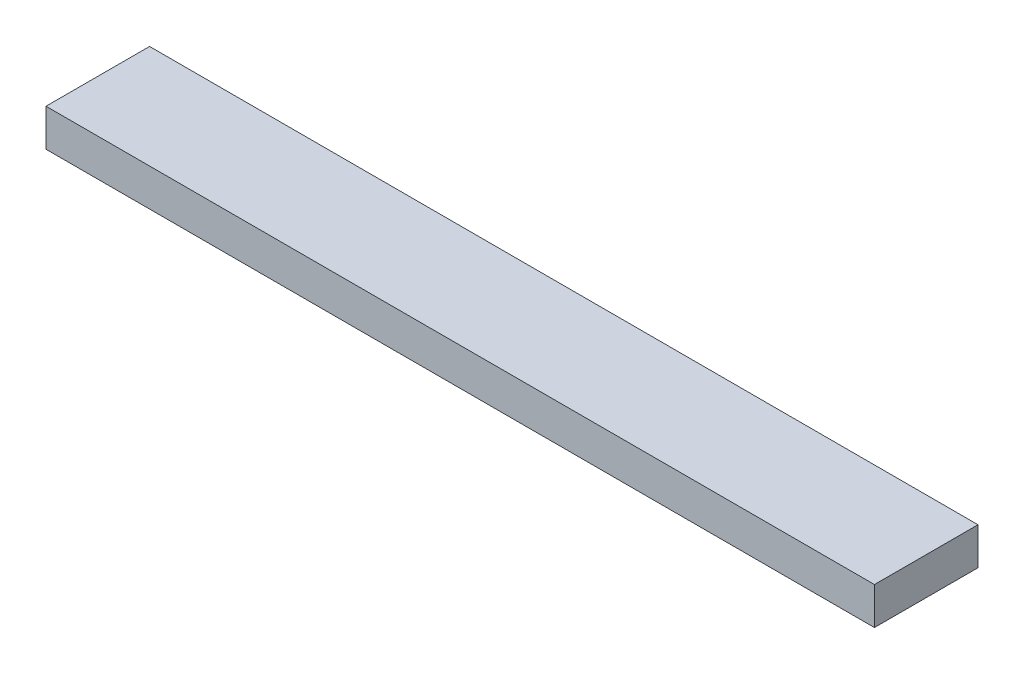
ISO-10303-21;
HEADER;
FILE_DESCRIPTION(('STEP AP214'),'2;1');
FILE_NAME('part.step','',(''),(''),'','','');
FILE_SCHEMA(('AUTOMOTIVE_DESIGN { 1 0 10303 214 1 1 1 1 }'));
ENDSEC;
DATA;
#1=APPLICATION_CONTEXT('core data for automotive mechanical design processes');
#2=APPLICATION_PROTOCOL_DEFINITION('international standard','automotive_design',2000,#1);
#3=PRODUCT_CONTEXT('',#1,'mechanical');
#4=PRODUCT('Part','Part','',(#3));
#5=PRODUCT_RELATED_PRODUCT_CATEGORY('part','',(#4));
#6=PRODUCT_DEFINITION_FORMATION('','',#4);
#7=PRODUCT_DEFINITION_CONTEXT('part definition',#1,'design');
#8=PRODUCT_DEFINITION('design','',#6,#7);
#9=PRODUCT_DEFINITION_SHAPE('','',#8);
#10=(LENGTH_UNIT() NAMED_UNIT(*) SI_UNIT(.MILLI.,.METRE.));
#11=(NAMED_UNIT(*) PLANE_ANGLE_UNIT() SI_UNIT($,.RADIAN.));
#12=(NAMED_UNIT(*) SI_UNIT($,.STERADIAN.) SOLID_ANGLE_UNIT());
#13=UNCERTAINTY_MEASURE_WITH_UNIT(LENGTH_MEASURE(1.E-05),#10,'distance_accuracy_value','');
#14=(GEOMETRIC_REPRESENTATION_CONTEXT(3) GLOBAL_UNCERTAINTY_ASSIGNED_CONTEXT((#13)) GLOBAL_UNIT_ASSIGNED_CONTEXT((#10,
#11,#12)) REPRESENTATION_CONTEXT('',''));
#15=CARTESIAN_POINT('',(0.,0.,0.));
#16=DIRECTION('',(0.,0.,1.));
#17=DIRECTION('',(1.,0.,0.));
#18=AXIS2_PLACEMENT_3D('',#15,#16,#17);
#19=CARTESIAN_POINT('',(50.,4.5,6.25000000000001));
#20=DIRECTION('',(-1.,0.,0.));
#21=DIRECTION('',(0.,0.,1.));
#22=AXIS2_PLACEMENT_3D('',#19,#20,#21);
#23=PLANE('',#22);
#24=DIRECTION('',(0.,0.,-1.));
#25=VECTOR('',#24,1.);
#26=CARTESIAN_POINT('',(50.,0.,6.25000000000001));
#27=LINE('',#26,#25);
#28=CARTESIAN_POINT('',(50.,0.,6.25000000000001));
#29=VERTEX_POINT('',#28);
#30=CARTESIAN_POINT('',(50.,0.,-6.24999999999999));
#31=VERTEX_POINT('',#30);
#32=EDGE_CURVE('E103',#29,#31,#27,.T.);
#33=ORIENTED_EDGE('',*,*,#32,.T.);
#34=DIRECTION('',(0.,-1.,0.));
#35=VECTOR('',#34,1.);
#36=CARTESIAN_POINT('',(50.,4.5,-6.24999999999999));
#37=LINE('',#36,#35);
#38=CARTESIAN_POINT('',(50.,4.5,-6.24999999999999));
#39=VERTEX_POINT('',#38);
#40=EDGE_CURVE('E11',#39,#31,#37,.T.);
#41=ORIENTED_EDGE('',*,*,#40,.F.);
#42=DIRECTION('',(0.,0.,-1.));
#43=VECTOR('',#42,1.);
#44=CARTESIAN_POINT('',(50.,4.5,6.25000000000001));
#45=LINE('',#44,#43);
#46=CARTESIAN_POINT('',(50.,4.5,6.25000000000001));
#47=VERTEX_POINT('',#46);
#48=EDGE_CURVE('E91',#47,#39,#45,.T.);
#49=ORIENTED_EDGE('',*,*,#48,.F.);
#50=DIRECTION('',(0.,-1.,0.));
#51=VECTOR('',#50,1.);
#52=CARTESIAN_POINT('',(50.,4.5,6.25000000000001));
#53=LINE('',#52,#51);
#54=EDGE_CURVE('E99',#47,#29,#53,.T.);
#55=ORIENTED_EDGE('',*,*,#54,.T.);
#56=EDGE_LOOP('',(#33,#41,#49,#55));
#57=FACE_BOUND('',#56,.T.);
#58=ADVANCED_FACE('F40',(#57),#23,.F.);
#59=CARTESIAN_POINT('',(-50.,4.5,-6.24999999999999));
#60=DIRECTION('',(0.,0.,1.));
#61=DIRECTION('',(1.,0.,0.));
#62=AXIS2_PLACEMENT_3D('',#59,#60,#61);
#63=PLANE('',#62);
#64=DIRECTION('',(-1.,0.,0.));
#65=VECTOR('',#64,1.);
#66=CARTESIAN_POINT('',(-50.,0.,-6.24999999999999));
#67=LINE('',#66,#65);
#68=CARTESIAN_POINT('',(-50.,0.,-6.24999999999999));
#69=VERTEX_POINT('',#68);
#70=EDGE_CURVE('E95',#31,#69,#67,.T.);
#71=ORIENTED_EDGE('',*,*,#70,.T.);
#72=DIRECTION('',(0.,-1.,0.));
#73=VECTOR('',#72,1.);
#74=CARTESIAN_POINT('',(-50.,4.5,-6.24999999999999));
#75=LINE('',#74,#73);
#76=CARTESIAN_POINT('',(-50.,4.5,-6.24999999999999));
#77=VERTEX_POINT('',#76);
#78=EDGE_CURVE('E48',#77,#69,#75,.T.);
#79=ORIENTED_EDGE('',*,*,#78,.F.);
#80=DIRECTION('',(-1.,0.,0.));
#81=VECTOR('',#80,1.);
#82=CARTESIAN_POINT('',(-50.,4.5,-6.24999999999999));
#83=LINE('',#82,#81);
#84=EDGE_CURVE('E86',#39,#77,#83,.T.);
#85=ORIENTED_EDGE('',*,*,#84,.F.);
#86=ORIENTED_EDGE('',*,*,#40,.T.);
#87=EDGE_LOOP('',(#71,#79,#85,#86));
#88=FACE_BOUND('',#87,.T.);
#89=ADVANCED_FACE('F94',(#88),#63,.F.);
#90=CARTESIAN_POINT('',(-50.,4.5,6.25000000000001));
#91=DIRECTION('',(1.,0.,0.));
#92=DIRECTION('',(0.,0.,-1.));
#93=AXIS2_PLACEMENT_3D('',#90,#91,#92);
#94=PLANE('',#93);
#95=DIRECTION('',(0.,0.,1.));
#96=VECTOR('',#95,1.);
#97=CARTESIAN_POINT('',(-50.,0.,6.25000000000001));
#98=LINE('',#97,#96);
#99=CARTESIAN_POINT('',(-50.,0.,6.25000000000001));
#100=VERTEX_POINT('',#99);
#101=EDGE_CURVE('E73',#69,#100,#98,.T.);
#102=ORIENTED_EDGE('',*,*,#101,.T.);
#103=DIRECTION('',(0.,-1.,0.));
#104=VECTOR('',#103,1.);
#105=CARTESIAN_POINT('',(-50.,4.5,6.25000000000001));
#106=LINE('',#105,#104);
#107=CARTESIAN_POINT('',(-50.,4.5,6.25000000000001));
#108=VERTEX_POINT('',#107);
#109=EDGE_CURVE('E96',#108,#100,#106,.T.);
#110=ORIENTED_EDGE('',*,*,#109,.F.);
#111=DIRECTION('',(0.,0.,1.));
#112=VECTOR('',#111,1.);
#113=CARTESIAN_POINT('',(-50.,4.5,6.25000000000001));
#114=LINE('',#113,#112);
#115=EDGE_CURVE('E89',#77,#108,#114,.T.);
#116=ORIENTED_EDGE('',*,*,#115,.F.);
#117=ORIENTED_EDGE('',*,*,#78,.T.);
#118=EDGE_LOOP('',(#102,#110,#116,#117));
#119=FACE_BOUND('',#118,.T.);
#120=ADVANCED_FACE('F97',(#119),#94,.F.);
#121=CARTESIAN_POINT('',(-50.,4.5,6.25000000000001));
#122=DIRECTION('',(0.,0.,-1.));
#123=DIRECTION('',(-1.,0.,0.));
#124=AXIS2_PLACEMENT_3D('',#121,#122,#123);
#125=PLANE('',#124);
#126=DIRECTION('',(1.,0.,0.));
#127=VECTOR('',#126,1.);
#128=CARTESIAN_POINT('',(-50.,0.,6.25000000000001));
#129=LINE('',#128,#127);
#130=EDGE_CURVE('E79',#100,#29,#129,.T.);
#131=ORIENTED_EDGE('',*,*,#130,.T.);
#132=ORIENTED_EDGE('',*,*,#54,.F.);
#133=DIRECTION('',(1.,0.,0.));
#134=VECTOR('',#133,1.);
#135=CARTESIAN_POINT('',(-50.,4.5,6.25000000000001));
#136=LINE('',#135,#134);
#137=EDGE_CURVE('E56',#108,#47,#136,.T.);
#138=ORIENTED_EDGE('',*,*,#137,.F.);
#139=ORIENTED_EDGE('',*,*,#109,.T.);
#140=EDGE_LOOP('',(#131,#132,#138,#139));
#141=FACE_BOUND('',#140,.T.);
#142=ADVANCED_FACE('F110',(#141),#125,.F.);
#143=CARTESIAN_POINT('',(0.,4.5,0.));
#144=DIRECTION('',(0.,-1.,0.));
#145=DIRECTION('',(0.,0.,-1.));
#146=AXIS2_PLACEMENT_3D('',#143,#144,#145);
#147=PLANE('',#146);
#148=ORIENTED_EDGE('',*,*,#48,.T.);
#149=ORIENTED_EDGE('',*,*,#84,.T.);
#150=ORIENTED_EDGE('',*,*,#115,.T.);
#151=ORIENTED_EDGE('',*,*,#137,.T.);
#152=EDGE_LOOP('',(#148,#149,#150,#151));
#153=FACE_BOUND('',#152,.T.);
#154=ADVANCED_FACE('F87',(#153),#147,.F.);
#155=CARTESIAN_POINT('',(0.,0.,0.));
#156=DIRECTION('',(0.,-1.,0.));
#157=DIRECTION('',(0.,0.,-1.));
#158=AXIS2_PLACEMENT_3D('',#155,#156,#157);
#159=PLANE('',#158);
#160=ORIENTED_EDGE('',*,*,#32,.F.);
#161=ORIENTED_EDGE('',*,*,#130,.F.);
#162=ORIENTED_EDGE('',*,*,#101,.F.);
#163=ORIENTED_EDGE('',*,*,#70,.F.);
#164=EDGE_LOOP('',(#160,#161,#162,#163));
#165=FACE_BOUND('',#164,.T.);
#166=ADVANCED_FACE('F113',(#165),#159,.T.);
#167=CLOSED_SHELL('',(#58,#89,#120,#142,#154,#166));
#168=MANIFOLD_SOLID_BREP('B2',#167);
#169=ADVANCED_BREP_SHAPE_REPRESENTATION('',(#18,#168),#14);
#170=SHAPE_DEFINITION_REPRESENTATION(#9,#169);
ENDSEC;
END-ISO-10303-21;
